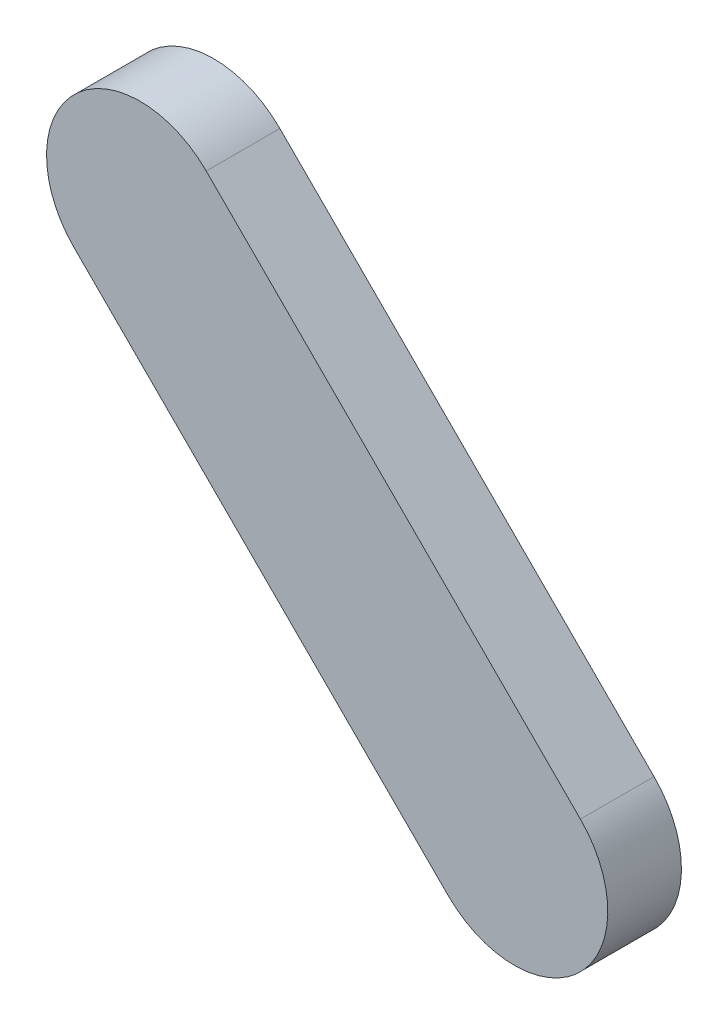
ISO-10303-21;
HEADER;
FILE_DESCRIPTION(('STEP AP214'),'2;1');
FILE_NAME('part.step','',(''),(''),'','','');
FILE_SCHEMA(('AUTOMOTIVE_DESIGN { 1 0 10303 214 1 1 1 1 }'));
ENDSEC;
DATA;
#1=APPLICATION_CONTEXT('core data for automotive mechanical design processes');
#2=APPLICATION_PROTOCOL_DEFINITION('international standard','automotive_design',2000,#1);
#3=PRODUCT_CONTEXT('',#1,'mechanical');
#4=PRODUCT('Part','Part','',(#3));
#5=PRODUCT_RELATED_PRODUCT_CATEGORY('part','',(#4));
#6=PRODUCT_DEFINITION_FORMATION('','',#4);
#7=PRODUCT_DEFINITION_CONTEXT('part definition',#1,'design');
#8=PRODUCT_DEFINITION('design','',#6,#7);
#9=PRODUCT_DEFINITION_SHAPE('','',#8);
#10=(LENGTH_UNIT() NAMED_UNIT(*) SI_UNIT(.MILLI.,.METRE.));
#11=(NAMED_UNIT(*) PLANE_ANGLE_UNIT() SI_UNIT($,.RADIAN.));
#12=(NAMED_UNIT(*) SI_UNIT($,.STERADIAN.) SOLID_ANGLE_UNIT());
#13=UNCERTAINTY_MEASURE_WITH_UNIT(LENGTH_MEASURE(1.E-05),#10,'distance_accuracy_value','');
#14=(GEOMETRIC_REPRESENTATION_CONTEXT(3) GLOBAL_UNCERTAINTY_ASSIGNED_CONTEXT((#13)) GLOBAL_UNIT_ASSIGNED_CONTEXT((#10,
#11,#12)) REPRESENTATION_CONTEXT('',''));
#15=CARTESIAN_POINT('',(0.,0.,0.));
#16=DIRECTION('',(0.,0.,1.));
#17=DIRECTION('',(1.,0.,0.));
#18=AXIS2_PLACEMENT_3D('',#15,#16,#17);
#19=CARTESIAN_POINT('',(137.61539406,60.9073966,0.));
#20=DIRECTION('',(0.707106781186543,0.707106781186553,0.));
#21=DIRECTION('',(0.707106781186553,-0.707106781186543,0.));
#22=AXIS2_PLACEMENT_3D('',#19,#20,#21);
#23=PLANE('',#22);
#24=DIRECTION('',(0.707106781186553,-0.707106781186543,0.));
#25=VECTOR('',#24,1.);
#26=CARTESIAN_POINT('',(137.61539406,60.9073966,0.1999996));
#27=LINE('',#26,#25);
#28=CARTESIAN_POINT('',(137.61539406,60.9073966,0.1999996));
#29=VERTEX_POINT('',#28);
#30=CARTESIAN_POINT('',(138.6313966,59.89139406,0.1999996));
#31=VERTEX_POINT('',#30);
#32=EDGE_CURVE('E11',#29,#31,#27,.T.);
#33=ORIENTED_EDGE('',*,*,#32,.F.);
#34=DIRECTION('',(0.,0.,1.));
#35=VECTOR('',#34,1.);
#36=CARTESIAN_POINT('',(137.61539406,60.9073966,0.));
#37=LINE('',#36,#35);
#38=CARTESIAN_POINT('',(137.61539406,60.9073966,0.));
#39=VERTEX_POINT('',#38);
#40=EDGE_CURVE('E24',#39,#29,#37,.T.);
#41=ORIENTED_EDGE('',*,*,#40,.F.);
#42=DIRECTION('',(0.707106781186553,-0.707106781186543,0.));
#43=VECTOR('',#42,1.);
#44=CARTESIAN_POINT('',(137.61539406,60.9073966,0.));
#45=LINE('',#44,#43);
#46=CARTESIAN_POINT('',(138.6313966,59.89139406,0.));
#47=VERTEX_POINT('',#46);
#48=EDGE_CURVE('E75',#39,#47,#45,.T.);
#49=ORIENTED_EDGE('',*,*,#48,.T.);
#50=DIRECTION('',(0.,0.,1.));
#51=VECTOR('',#50,1.);
#52=CARTESIAN_POINT('',(138.6313966,59.89139406,0.));
#53=LINE('',#52,#51);
#54=EDGE_CURVE('E37',#47,#31,#53,.T.);
#55=ORIENTED_EDGE('',*,*,#54,.T.);
#56=EDGE_LOOP('',(#33,#41,#49,#55));
#57=FACE_BOUND('',#56,.T.);
#58=ADVANCED_FACE('F17',(#57),#23,.F.);
#59=CARTESIAN_POINT('',(138.81100127,60.07099873,0.));
#60=DIRECTION('',(0.,0.,-1.));
#61=DIRECTION('',(-0.707106781186548,-0.707106781186548,0.));
#62=AXIS2_PLACEMENT_3D('',#59,#60,#61);
#63=CYLINDRICAL_SURFACE('',#62,0.253999360179547);
#64=CARTESIAN_POINT('',(138.81100127,60.07099873,0.1999996));
#65=DIRECTION('',(0.,0.,1.));
#66=DIRECTION('',(-0.707106781186548,-0.707106781186548,0.));
#67=AXIS2_PLACEMENT_3D('',#64,#65,#66);
#68=CIRCLE('',#67,0.253999360179547);
#69=CARTESIAN_POINT('',(138.99060594,60.2506034,0.1999996));
#70=VERTEX_POINT('',#69);
#71=EDGE_CURVE('E83',#31,#70,#68,.T.);
#72=ORIENTED_EDGE('',*,*,#71,.F.);
#73=ORIENTED_EDGE('',*,*,#54,.F.);
#74=CARTESIAN_POINT('',(138.81100127,60.07099873,0.));
#75=DIRECTION('',(0.,0.,1.));
#76=DIRECTION('',(-0.707106781186548,-0.707106781186548,0.));
#77=AXIS2_PLACEMENT_3D('',#74,#75,#76);
#78=CIRCLE('',#77,0.253999360179547);
#79=CARTESIAN_POINT('',(138.99060594,60.2506034,0.));
#80=VERTEX_POINT('',#79);
#81=EDGE_CURVE('E81',#47,#80,#78,.T.);
#82=ORIENTED_EDGE('',*,*,#81,.T.);
#83=DIRECTION('',(0.,0.,1.));
#84=VECTOR('',#83,1.);
#85=CARTESIAN_POINT('',(138.99060594,60.2506034,0.));
#86=LINE('',#85,#84);
#87=EDGE_CURVE('E67',#80,#70,#86,.T.);
#88=ORIENTED_EDGE('',*,*,#87,.T.);
#89=EDGE_LOOP('',(#72,#73,#82,#88));
#90=FACE_BOUND('',#89,.T.);
#91=ADVANCED_FACE('F89',(#90),#63,.T.);
#92=CARTESIAN_POINT('',(138.99060594,60.2506034,0.));
#93=DIRECTION('',(-0.707106781186555,-0.70710678118654,0.));
#94=DIRECTION('',(-0.70710678118654,0.707106781186555,0.));
#95=AXIS2_PLACEMENT_3D('',#92,#93,#94);
#96=PLANE('',#95);
#97=DIRECTION('',(-0.70710678118654,0.707106781186555,0.));
#98=VECTOR('',#97,1.);
#99=CARTESIAN_POINT('',(138.99060594,60.2506034,0.1999996));
#100=LINE('',#99,#98);
#101=CARTESIAN_POINT('',(137.9746034,61.26660594,0.1999996));
#102=VERTEX_POINT('',#101);
#103=EDGE_CURVE('E71',#70,#102,#100,.T.);
#104=ORIENTED_EDGE('',*,*,#103,.F.);
#105=ORIENTED_EDGE('',*,*,#87,.F.);
#106=DIRECTION('',(-0.70710678118654,0.707106781186555,0.));
#107=VECTOR('',#106,1.);
#108=CARTESIAN_POINT('',(138.99060594,60.2506034,0.));
#109=LINE('',#108,#107);
#110=CARTESIAN_POINT('',(137.9746034,61.26660594,0.));
#111=VERTEX_POINT('',#110);
#112=EDGE_CURVE('E63',#80,#111,#109,.T.);
#113=ORIENTED_EDGE('',*,*,#112,.T.);
#114=DIRECTION('',(0.,0.,1.));
#115=VECTOR('',#114,1.);
#116=CARTESIAN_POINT('',(137.9746034,61.26660594,0.));
#117=LINE('',#116,#115);
#118=EDGE_CURVE('E53',#111,#102,#117,.T.);
#119=ORIENTED_EDGE('',*,*,#118,.T.);
#120=EDGE_LOOP('',(#104,#105,#113,#119));
#121=FACE_BOUND('',#120,.T.);
#122=ADVANCED_FACE('F66',(#121),#96,.F.);
#123=CARTESIAN_POINT('',(137.79499873,61.08700127,0.));
#124=DIRECTION('',(0.,0.,-1.));
#125=DIRECTION('',(0.707106781186604,0.707106781186492,0.));
#126=AXIS2_PLACEMENT_3D('',#123,#124,#125);
#127=CYLINDRICAL_SURFACE('',#126,0.253999360179556);
#128=CARTESIAN_POINT('',(137.79499873,61.08700127,0.1999996));
#129=DIRECTION('',(0.,0.,1.));
#130=DIRECTION('',(0.707106781186604,0.707106781186492,0.));
#131=AXIS2_PLACEMENT_3D('',#128,#129,#130);
#132=CIRCLE('',#131,0.253999360179556);
#133=EDGE_CURVE('E59',#102,#29,#132,.T.);
#134=ORIENTED_EDGE('',*,*,#133,.F.);
#135=ORIENTED_EDGE('',*,*,#118,.F.);
#136=CARTESIAN_POINT('',(137.79499873,61.08700127,0.));
#137=DIRECTION('',(0.,0.,1.));
#138=DIRECTION('',(0.707106781186604,0.707106781186492,0.));
#139=AXIS2_PLACEMENT_3D('',#136,#137,#138);
#140=CIRCLE('',#139,0.253999360179556);
#141=EDGE_CURVE('E57',#111,#39,#140,.T.);
#142=ORIENTED_EDGE('',*,*,#141,.T.);
#143=ORIENTED_EDGE('',*,*,#40,.T.);
#144=EDGE_LOOP('',(#134,#135,#142,#143));
#145=FACE_BOUND('',#144,.T.);
#146=ADVANCED_FACE('F55',(#145),#127,.T.);
#147=CARTESIAN_POINT('',(137.61539406,60.9073966,0.));
#148=DIRECTION('',(0.,0.,-1.));
#149=DIRECTION('',(-1.,0.,0.));
#150=AXIS2_PLACEMENT_3D('',#147,#148,#149);
#151=PLANE('',#150);
#152=ORIENTED_EDGE('',*,*,#141,.F.);
#153=ORIENTED_EDGE('',*,*,#112,.F.);
#154=ORIENTED_EDGE('',*,*,#81,.F.);
#155=ORIENTED_EDGE('',*,*,#48,.F.);
#156=EDGE_LOOP('',(#152,#153,#154,#155));
#157=FACE_BOUND('',#156,.T.);
#158=ADVANCED_FACE('F74',(#157),#151,.T.);
#159=CARTESIAN_POINT('',(137.61539406,60.9073966,0.1999996));
#160=DIRECTION('',(0.,0.,-1.));
#161=DIRECTION('',(-1.,0.,0.));
#162=AXIS2_PLACEMENT_3D('',#159,#160,#161);
#163=PLANE('',#162);
#164=ORIENTED_EDGE('',*,*,#32,.T.);
#165=ORIENTED_EDGE('',*,*,#71,.T.);
#166=ORIENTED_EDGE('',*,*,#103,.T.);
#167=ORIENTED_EDGE('',*,*,#133,.T.);
#168=EDGE_LOOP('',(#164,#165,#166,#167));
#169=FACE_BOUND('',#168,.T.);
#170=ADVANCED_FACE('F91',(#169),#163,.F.);
#171=CLOSED_SHELL('',(#58,#91,#122,#146,#158,#170));
#172=MANIFOLD_SOLID_BREP('B1',#171);
#173=ADVANCED_BREP_SHAPE_REPRESENTATION('',(#18,#172),#14);
#174=SHAPE_DEFINITION_REPRESENTATION(#9,#173);
ENDSEC;
END-ISO-10303-21;
